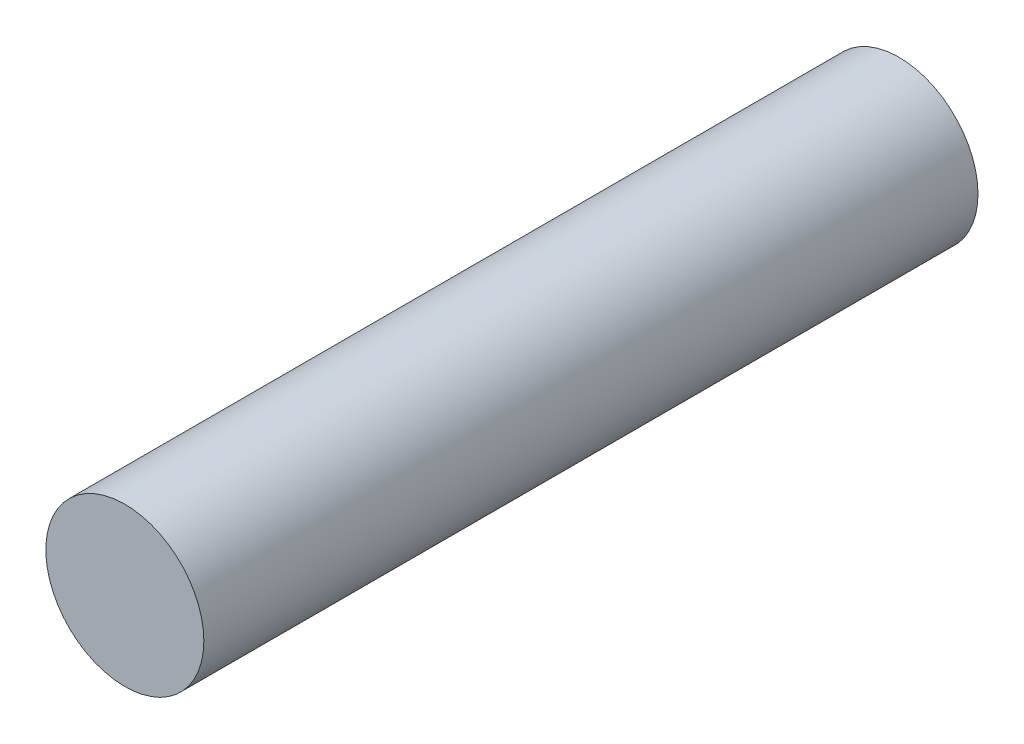
ISO-10303-21;
HEADER;
FILE_DESCRIPTION(('STEP AP214'),'2;1');
FILE_NAME('part.step','',(''),(''),'','','');
FILE_SCHEMA(('AUTOMOTIVE_DESIGN { 1 0 10303 214 1 1 1 1 }'));
ENDSEC;
DATA;
#1=APPLICATION_CONTEXT('core data for automotive mechanical design processes');
#2=APPLICATION_PROTOCOL_DEFINITION('international standard','automotive_design',2000,#1);
#3=PRODUCT_CONTEXT('',#1,'mechanical');
#4=PRODUCT('Part','Part','',(#3));
#5=PRODUCT_RELATED_PRODUCT_CATEGORY('part','',(#4));
#6=PRODUCT_DEFINITION_FORMATION('','',#4);
#7=PRODUCT_DEFINITION_CONTEXT('part definition',#1,'design');
#8=PRODUCT_DEFINITION('design','',#6,#7);
#9=PRODUCT_DEFINITION_SHAPE('','',#8);
#10=(LENGTH_UNIT() NAMED_UNIT(*) SI_UNIT(.MILLI.,.METRE.));
#11=(NAMED_UNIT(*) PLANE_ANGLE_UNIT() SI_UNIT($,.RADIAN.));
#12=(NAMED_UNIT(*) SI_UNIT($,.STERADIAN.) SOLID_ANGLE_UNIT());
#13=UNCERTAINTY_MEASURE_WITH_UNIT(LENGTH_MEASURE(1.E-05),#10,'distance_accuracy_value','');
#14=(GEOMETRIC_REPRESENTATION_CONTEXT(3) GLOBAL_UNCERTAINTY_ASSIGNED_CONTEXT((#13)) GLOBAL_UNIT_ASSIGNED_CONTEXT((#10,
#11,#12)) REPRESENTATION_CONTEXT('',''));
#15=CARTESIAN_POINT('',(0.,0.,0.));
#16=DIRECTION('',(0.,0.,1.));
#17=DIRECTION('',(1.,0.,0.));
#18=AXIS2_PLACEMENT_3D('',#15,#16,#17);
#19=CARTESIAN_POINT('',(0.,0.,9.8));
#20=DIRECTION('',(0.,0.,-1.));
#21=DIRECTION('',(-1.,0.,0.));
#22=AXIS2_PLACEMENT_3D('',#19,#20,#21);
#23=CYLINDRICAL_SURFACE('',#22,0.999999999999999);
#24=CARTESIAN_POINT('',(0.,0.,9.8));
#25=DIRECTION('',(0.,0.,1.));
#26=DIRECTION('',(1.,0.,0.));
#27=AXIS2_PLACEMENT_3D('',#24,#25,#26);
#28=CIRCLE('',#27,0.999999999999999);
#29=CARTESIAN_POINT('',(0.999999999999999,0.,9.8));
#30=VERTEX_POINT('',#29);
#31=EDGE_CURVE('E10',#30,#30,#28,.T.);
#32=ORIENTED_EDGE('',*,*,#31,.F.);
#33=EDGE_LOOP('',(#32));
#34=FACE_BOUND('',#33,.T.);
#35=CARTESIAN_POINT('',(0.,0.,0.));
#36=DIRECTION('',(0.,0.,1.));
#37=DIRECTION('',(1.,0.,0.));
#38=AXIS2_PLACEMENT_3D('',#35,#36,#37);
#39=CIRCLE('',#38,0.999999999999999);
#40=CARTESIAN_POINT('',(0.999999999999999,0.,0.));
#41=VERTEX_POINT('',#40);
#42=EDGE_CURVE('E46',#41,#41,#39,.T.);
#43=ORIENTED_EDGE('',*,*,#42,.T.);
#44=EDGE_LOOP('',(#43));
#45=FACE_BOUND('',#44,.T.);
#46=ADVANCED_FACE('F43',(#34,#45),#23,.T.);
#47=CARTESIAN_POINT('',(0.,0.,9.8));
#48=DIRECTION('',(0.,0.,1.));
#49=DIRECTION('',(1.,0.,0.));
#50=AXIS2_PLACEMENT_3D('',#47,#48,#49);
#51=PLANE('',#50);
#52=ORIENTED_EDGE('',*,*,#31,.T.);
#53=EDGE_LOOP('',(#52));
#54=FACE_BOUND('',#53,.T.);
#55=ADVANCED_FACE('F58',(#54),#51,.T.);
#56=CARTESIAN_POINT('',(0.,0.,0.));
#57=DIRECTION('',(0.,0.,1.));
#58=DIRECTION('',(1.,0.,0.));
#59=AXIS2_PLACEMENT_3D('',#56,#57,#58);
#60=PLANE('',#59);
#61=ORIENTED_EDGE('',*,*,#42,.F.);
#62=EDGE_LOOP('',(#61));
#63=FACE_BOUND('',#62,.T.);
#64=ADVANCED_FACE('F59',(#63),#60,.F.);
#65=CLOSED_SHELL('',(#46,#55,#64));
#66=MANIFOLD_SOLID_BREP('B2',#65);
#67=ADVANCED_BREP_SHAPE_REPRESENTATION('',(#18,#66),#14);
#68=SHAPE_DEFINITION_REPRESENTATION(#9,#67);
ENDSEC;
END-ISO-10303-21;
